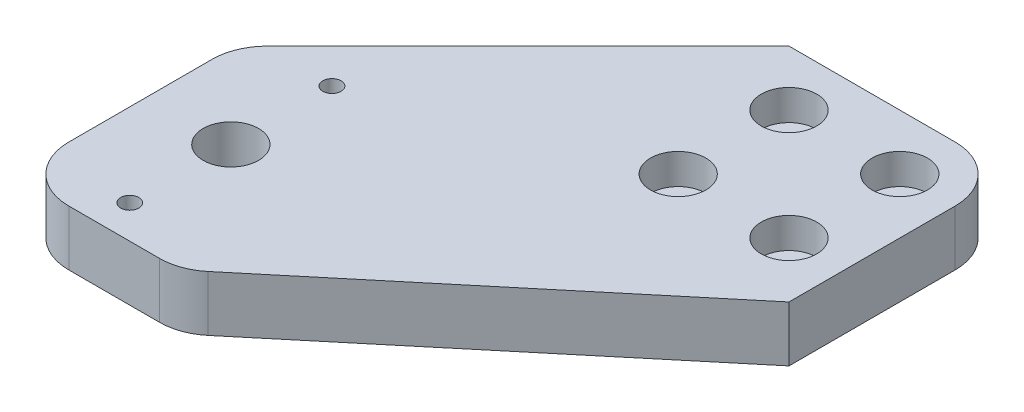
ISO-10303-21;
HEADER;
FILE_DESCRIPTION(('STEP AP214'),'2;1');
FILE_NAME('part.step','',(''),(''),'','','');
FILE_SCHEMA(('AUTOMOTIVE_DESIGN { 1 0 10303 214 1 1 1 1 }'));
ENDSEC;
DATA;
#1=APPLICATION_CONTEXT('core data for automotive mechanical design processes');
#2=APPLICATION_PROTOCOL_DEFINITION('international standard','automotive_design',2000,#1);
#3=PRODUCT_CONTEXT('',#1,'mechanical');
#4=PRODUCT('Part','Part','',(#3));
#5=PRODUCT_RELATED_PRODUCT_CATEGORY('part','',(#4));
#6=PRODUCT_DEFINITION_FORMATION('','',#4);
#7=PRODUCT_DEFINITION_CONTEXT('part definition',#1,'design');
#8=PRODUCT_DEFINITION('design','',#6,#7);
#9=PRODUCT_DEFINITION_SHAPE('','',#8);
#10=(LENGTH_UNIT() NAMED_UNIT(*) SI_UNIT(.MILLI.,.METRE.));
#11=(NAMED_UNIT(*) PLANE_ANGLE_UNIT() SI_UNIT($,.RADIAN.));
#12=(NAMED_UNIT(*) SI_UNIT($,.STERADIAN.) SOLID_ANGLE_UNIT());
#13=UNCERTAINTY_MEASURE_WITH_UNIT(LENGTH_MEASURE(1.E-05),#10,'distance_accuracy_value','');
#14=(GEOMETRIC_REPRESENTATION_CONTEXT(3) GLOBAL_UNCERTAINTY_ASSIGNED_CONTEXT((#13)) GLOBAL_UNIT_ASSIGNED_CONTEXT((#10,
#11,#12)) REPRESENTATION_CONTEXT('',''));
#15=CARTESIAN_POINT('',(0.,0.,0.));
#16=DIRECTION('',(0.,0.,1.));
#17=DIRECTION('',(1.,0.,0.));
#18=AXIS2_PLACEMENT_3D('',#15,#16,#17);
#19=CARTESIAN_POINT('',(-20.,5.,-20.));
#20=DIRECTION('',(0.707106781186548,0.,0.707106781186548));
#21=DIRECTION('',(0.707106781186548,0.,-0.707106781186548));
#22=AXIS2_PLACEMENT_3D('',#19,#20,#21);
#23=PLANE('',#22);
#24=DIRECTION('',(-0.707106781186547,0.,0.707106781186547));
#25=VECTOR('',#24,1.);
#26=CARTESIAN_POINT('',(-20.,-5.,-20.));
#27=LINE('',#26,#25);
#28=CARTESIAN_POINT('',(-20.,-5.,-20.));
#29=VERTEX_POINT('',#28);
#30=CARTESIAN_POINT('',(-67.0710678118655,-5.,27.0710678118655));
#31=VERTEX_POINT('',#30);
#32=EDGE_CURVE('E148',#29,#31,#27,.T.);
#33=ORIENTED_EDGE('',*,*,#32,.T.);
#34=DIRECTION('',(0.,-1.,0.));
#35=VECTOR('',#34,1.);
#36=CARTESIAN_POINT('',(-67.0710678118655,5.,27.0710678118655));
#37=LINE('',#36,#35);
#38=CARTESIAN_POINT('',(-67.0710678118655,5.,27.0710678118655));
#39=VERTEX_POINT('',#38);
#40=EDGE_CURVE('E191',#31,#39,#37,.F.);
#41=ORIENTED_EDGE('',*,*,#40,.T.);
#42=DIRECTION('',(-0.707106781186547,0.,0.707106781186547));
#43=VECTOR('',#42,1.);
#44=CARTESIAN_POINT('',(-20.,5.,-20.));
#45=LINE('',#44,#43);
#46=CARTESIAN_POINT('',(-20.,5.,-20.));
#47=VERTEX_POINT('',#46);
#48=EDGE_CURVE('E163',#47,#39,#45,.T.);
#49=ORIENTED_EDGE('',*,*,#48,.F.);
#50=DIRECTION('',(0.,-1.,0.));
#51=VECTOR('',#50,1.);
#52=CARTESIAN_POINT('',(-20.,5.,-20.));
#53=LINE('',#52,#51);
#54=EDGE_CURVE('E140',#47,#29,#53,.T.);
#55=ORIENTED_EDGE('',*,*,#54,.T.);
#56=EDGE_LOOP('',(#33,#41,#49,#55));
#57=FACE_BOUND('',#56,.T.);
#58=ADVANCED_FACE('F46',(#57),#23,.F.);
#59=CARTESIAN_POINT('',(-70.,5.,30.));
#60=DIRECTION('',(1.,0.,0.));
#61=DIRECTION('',(0.,0.,-1.));
#62=AXIS2_PLACEMENT_3D('',#59,#60,#61);
#63=PLANE('',#62);
#64=DIRECTION('',(0.,0.,1.));
#65=VECTOR('',#64,1.);
#66=CARTESIAN_POINT('',(-70.,-5.,30.));
#67=LINE('',#66,#65);
#68=CARTESIAN_POINT('',(-70.,-5.,34.1421356237309));
#69=VERTEX_POINT('',#68);
#70=CARTESIAN_POINT('',(-70.,-5.,60.));
#71=VERTEX_POINT('',#70);
#72=EDGE_CURVE('E151',#69,#71,#67,.T.);
#73=ORIENTED_EDGE('',*,*,#72,.T.);
#74=DIRECTION('',(0.,-1.,0.));
#75=VECTOR('',#74,1.);
#76=CARTESIAN_POINT('',(-70.,5.,60.));
#77=LINE('',#76,#75);
#78=CARTESIAN_POINT('',(-70.,5.,60.));
#79=VERTEX_POINT('',#78);
#80=EDGE_CURVE('E189',#71,#79,#77,.F.);
#81=ORIENTED_EDGE('',*,*,#80,.T.);
#82=DIRECTION('',(0.,0.,1.));
#83=VECTOR('',#82,1.);
#84=CARTESIAN_POINT('',(-70.,5.,30.));
#85=LINE('',#84,#83);
#86=CARTESIAN_POINT('',(-70.,5.,34.1421356237309));
#87=VERTEX_POINT('',#86);
#88=EDGE_CURVE('E213',#87,#79,#85,.T.);
#89=ORIENTED_EDGE('',*,*,#88,.F.);
#90=DIRECTION('',(0.,-1.,0.));
#91=VECTOR('',#90,1.);
#92=CARTESIAN_POINT('',(-70.,5.,34.1421356237309));
#93=LINE('',#92,#91);
#94=EDGE_CURVE('E186',#87,#69,#93,.T.);
#95=ORIENTED_EDGE('',*,*,#94,.T.);
#96=EDGE_LOOP('',(#73,#81,#89,#95));
#97=FACE_BOUND('',#96,.T.);
#98=ADVANCED_FACE('F216',(#97),#63,.F.);
#99=CARTESIAN_POINT('',(-70.,5.,70.));
#100=DIRECTION('',(0.,0.,-1.));
#101=DIRECTION('',(-1.,0.,0.));
#102=AXIS2_PLACEMENT_3D('',#99,#100,#101);
#103=PLANE('',#102);
#104=DIRECTION('',(1.,0.,0.));
#105=VECTOR('',#104,1.);
#106=CARTESIAN_POINT('',(-70.,-5.,70.));
#107=LINE('',#106,#105);
#108=CARTESIAN_POINT('',(-60.,-5.,70.));
#109=VERTEX_POINT('',#108);
#110=CARTESIAN_POINT('',(-43.6204993518133,-5.,70.));
#111=VERTEX_POINT('',#110);
#112=EDGE_CURVE('E155',#109,#111,#107,.T.);
#113=ORIENTED_EDGE('',*,*,#112,.T.);
#114=DIRECTION('',(0.,-1.,0.));
#115=VECTOR('',#114,1.);
#116=CARTESIAN_POINT('',(-43.6204993518133,5.,70.));
#117=LINE('',#116,#115);
#118=CARTESIAN_POINT('',(-43.6204993518133,5.,70.));
#119=VERTEX_POINT('',#118);
#120=EDGE_CURVE('E178',#111,#119,#117,.F.);
#121=ORIENTED_EDGE('',*,*,#120,.T.);
#122=DIRECTION('',(1.,0.,0.));
#123=VECTOR('',#122,1.);
#124=CARTESIAN_POINT('',(-70.,5.,70.));
#125=LINE('',#124,#123);
#126=CARTESIAN_POINT('',(-60.,5.,70.));
#127=VERTEX_POINT('',#126);
#128=EDGE_CURVE('E131',#127,#119,#125,.T.);
#129=ORIENTED_EDGE('',*,*,#128,.F.);
#130=DIRECTION('',(0.,-1.,0.));
#131=VECTOR('',#130,1.);
#132=CARTESIAN_POINT('',(-60.,5.,70.));
#133=LINE('',#132,#131);
#134=EDGE_CURVE('E175',#127,#109,#133,.T.);
#135=ORIENTED_EDGE('',*,*,#134,.T.);
#136=EDGE_LOOP('',(#113,#121,#129,#135));
#137=FACE_BOUND('',#136,.T.);
#138=ADVANCED_FACE('F334',(#137),#103,.F.);
#139=CARTESIAN_POINT('',(-40.,5.,70.));
#140=DIRECTION('',(-0.64018439966448,0.,-0.768221279597376));
#141=DIRECTION('',(-0.768221279597376,0.,0.64018439966448));
#142=AXIS2_PLACEMENT_3D('',#139,#140,#141);
#143=PLANE('',#142);
#144=DIRECTION('',(0.768221279597376,0.,-0.64018439966448));
#145=VECTOR('',#144,1.);
#146=CARTESIAN_POINT('',(-40.,5.,70.));
#147=LINE('',#146,#145);
#148=CARTESIAN_POINT('',(-37.2186553551685,5.,67.6822127959738));
#149=VERTEX_POINT('',#148);
#150=CARTESIAN_POINT('',(20.,5.,20.));
#151=VERTEX_POINT('',#150);
#152=EDGE_CURVE('E121',#149,#151,#147,.T.);
#153=ORIENTED_EDGE('',*,*,#152,.F.);
#154=DIRECTION('',(0.,-1.,0.));
#155=VECTOR('',#154,1.);
#156=CARTESIAN_POINT('',(-37.2186553551685,5.,67.6822127959738));
#157=LINE('',#156,#155);
#158=CARTESIAN_POINT('',(-37.2186553551685,-5.,67.6822127959738));
#159=VERTEX_POINT('',#158);
#160=EDGE_CURVE('E139',#149,#159,#157,.T.);
#161=ORIENTED_EDGE('',*,*,#160,.T.);
#162=DIRECTION('',(0.768221279597376,0.,-0.64018439966448));
#163=VECTOR('',#162,1.);
#164=CARTESIAN_POINT('',(-40.,-5.,70.));
#165=LINE('',#164,#163);
#166=CARTESIAN_POINT('',(20.,-5.,20.));
#167=VERTEX_POINT('',#166);
#168=EDGE_CURVE('E137',#159,#167,#165,.T.);
#169=ORIENTED_EDGE('',*,*,#168,.T.);
#170=DIRECTION('',(0.,-1.,0.));
#171=VECTOR('',#170,1.);
#172=CARTESIAN_POINT('',(20.,5.,20.));
#173=LINE('',#172,#171);
#174=EDGE_CURVE('E134',#151,#167,#173,.T.);
#175=ORIENTED_EDGE('',*,*,#174,.F.);
#176=EDGE_LOOP('',(#153,#161,#169,#175));
#177=FACE_BOUND('',#176,.T.);
#178=ADVANCED_FACE('F135',(#177),#143,.F.);
#179=CARTESIAN_POINT('',(20.,5.,-20.));
#180=DIRECTION('',(-1.,0.,0.));
#181=DIRECTION('',(0.,0.,1.));
#182=AXIS2_PLACEMENT_3D('',#179,#180,#181);
#183=PLANE('',#182);
#184=DIRECTION('',(0.,0.,-1.));
#185=VECTOR('',#184,1.);
#186=CARTESIAN_POINT('',(20.,-5.,-20.));
#187=LINE('',#186,#185);
#188=CARTESIAN_POINT('',(20.,-5.,-10.));
#189=VERTEX_POINT('',#188);
#190=EDGE_CURVE('E159',#167,#189,#187,.T.);
#191=ORIENTED_EDGE('',*,*,#190,.T.);
#192=DIRECTION('',(0.,-1.,0.));
#193=VECTOR('',#192,1.);
#194=CARTESIAN_POINT('',(20.,5.,-10.));
#195=LINE('',#194,#193);
#196=CARTESIAN_POINT('',(20.,5.,-10.));
#197=VERTEX_POINT('',#196);
#198=EDGE_CURVE('E11',#189,#197,#195,.F.);
#199=ORIENTED_EDGE('',*,*,#198,.T.);
#200=DIRECTION('',(0.,0.,-1.));
#201=VECTOR('',#200,1.);
#202=CARTESIAN_POINT('',(20.,5.,-20.));
#203=LINE('',#202,#201);
#204=EDGE_CURVE('E125',#151,#197,#203,.T.);
#205=ORIENTED_EDGE('',*,*,#204,.F.);
#206=ORIENTED_EDGE('',*,*,#174,.T.);
#207=EDGE_LOOP('',(#191,#199,#205,#206));
#208=FACE_BOUND('',#207,.T.);
#209=ADVANCED_FACE('F142',(#208),#183,.F.);
#210=CARTESIAN_POINT('',(-20.,5.,-20.));
#211=DIRECTION('',(0.,0.,1.));
#212=DIRECTION('',(1.,0.,0.));
#213=AXIS2_PLACEMENT_3D('',#210,#211,#212);
#214=PLANE('',#213);
#215=DIRECTION('',(-1.,0.,0.));
#216=VECTOR('',#215,1.);
#217=CARTESIAN_POINT('',(-20.,5.,-20.));
#218=LINE('',#217,#216);
#219=CARTESIAN_POINT('',(10.,5.,-20.));
#220=VERTEX_POINT('',#219);
#221=EDGE_CURVE('E143',#220,#47,#218,.T.);
#222=ORIENTED_EDGE('',*,*,#221,.F.);
#223=DIRECTION('',(0.,-1.,0.));
#224=VECTOR('',#223,1.);
#225=CARTESIAN_POINT('',(10.,5.,-20.));
#226=LINE('',#225,#224);
#227=CARTESIAN_POINT('',(10.,-5.,-20.));
#228=VERTEX_POINT('',#227);
#229=EDGE_CURVE('E54',#220,#228,#226,.T.);
#230=ORIENTED_EDGE('',*,*,#229,.T.);
#231=DIRECTION('',(-1.,0.,0.));
#232=VECTOR('',#231,1.);
#233=CARTESIAN_POINT('',(-20.,-5.,-20.));
#234=LINE('',#233,#232);
#235=EDGE_CURVE('E161',#228,#29,#234,.T.);
#236=ORIENTED_EDGE('',*,*,#235,.T.);
#237=ORIENTED_EDGE('',*,*,#54,.F.);
#238=EDGE_LOOP('',(#222,#230,#236,#237));
#239=FACE_BOUND('',#238,.T.);
#240=ADVANCED_FACE('F196',(#239),#214,.F.);
#241=CARTESIAN_POINT('',(0.,5.,0.));
#242=DIRECTION('',(0.,1.,0.));
#243=DIRECTION('',(0.,0.,1.));
#244=AXIS2_PLACEMENT_3D('',#241,#242,#243);
#245=PLANE('',#244);
#246=CARTESIAN_POINT('',(-55.,5.,45.75));
#247=DIRECTION('',(0.,1.,0.));
#248=DIRECTION('',(0.,0.,1.));
#249=AXIS2_PLACEMENT_3D('',#246,#247,#248);
#250=CIRCLE('',#249,5.);
#251=CARTESIAN_POINT('',(-55.,5.,50.75));
#252=VERTEX_POINT('',#251);
#253=EDGE_CURVE('E281',#252,#252,#250,.T.);
#254=ORIENTED_EDGE('',*,*,#253,.F.);
#255=EDGE_LOOP('',(#254));
#256=FACE_BOUND('',#255,.T.);
#257=CARTESIAN_POINT('',(-55.,5.,27.5));
#258=DIRECTION('',(0.,1.,0.));
#259=DIRECTION('',(0.,0.,1.));
#260=AXIS2_PLACEMENT_3D('',#257,#258,#259);
#261=CIRCLE('',#260,1.64999999999999);
#262=CARTESIAN_POINT('',(-55.,5.,29.15));
#263=VERTEX_POINT('',#262);
#264=EDGE_CURVE('E277',#263,#263,#261,.T.);
#265=ORIENTED_EDGE('',*,*,#264,.F.);
#266=EDGE_LOOP('',(#265));
#267=FACE_BOUND('',#266,.T.);
#268=CARTESIAN_POINT('',(-55.,5.,64.));
#269=DIRECTION('',(0.,1.,0.));
#270=DIRECTION('',(0.,0.,1.));
#271=AXIS2_PLACEMENT_3D('',#268,#269,#270);
#272=CIRCLE('',#271,1.64999999999998);
#273=CARTESIAN_POINT('',(-55.,5.,65.65));
#274=VERTEX_POINT('',#273);
#275=EDGE_CURVE('E271',#274,#274,#272,.T.);
#276=ORIENTED_EDGE('',*,*,#275,.F.);
#277=EDGE_LOOP('',(#276));
#278=FACE_BOUND('',#277,.T.);
#279=CARTESIAN_POINT('',(-10.,5.,-10.));
#280=DIRECTION('',(0.,1.,0.));
#281=DIRECTION('',(0.,0.,1.));
#282=AXIS2_PLACEMENT_3D('',#279,#280,#281);
#283=CIRCLE('',#282,4.99999999999999);
#284=CARTESIAN_POINT('',(-10.,5.,-5.00000000000001));
#285=VERTEX_POINT('',#284);
#286=EDGE_CURVE('E265',#285,#285,#283,.T.);
#287=ORIENTED_EDGE('',*,*,#286,.F.);
#288=EDGE_LOOP('',(#287));
#289=FACE_BOUND('',#288,.T.);
#290=CARTESIAN_POINT('',(10.,5.,-10.));
#291=DIRECTION('',(0.,1.,0.));
#292=DIRECTION('',(0.,0.,1.));
#293=AXIS2_PLACEMENT_3D('',#290,#291,#292);
#294=CIRCLE('',#293,4.99999999999999);
#295=CARTESIAN_POINT('',(10.,5.,-5.00000000000001));
#296=VERTEX_POINT('',#295);
#297=EDGE_CURVE('E253',#296,#296,#294,.T.);
#298=ORIENTED_EDGE('',*,*,#297,.F.);
#299=EDGE_LOOP('',(#298));
#300=FACE_BOUND('',#299,.T.);
#301=CARTESIAN_POINT('',(10.,5.,10.));
#302=DIRECTION('',(0.,1.,0.));
#303=DIRECTION('',(0.,0.,1.));
#304=AXIS2_PLACEMENT_3D('',#301,#302,#303);
#305=CIRCLE('',#304,4.99999999999999);
#306=CARTESIAN_POINT('',(10.,5.,15.));
#307=VERTEX_POINT('',#306);
#308=EDGE_CURVE('E241',#307,#307,#305,.T.);
#309=ORIENTED_EDGE('',*,*,#308,.F.);
#310=EDGE_LOOP('',(#309));
#311=FACE_BOUND('',#310,.T.);
#312=CARTESIAN_POINT('',(-10.,5.,10.));
#313=DIRECTION('',(0.,1.,0.));
#314=DIRECTION('',(0.,0.,1.));
#315=AXIS2_PLACEMENT_3D('',#312,#313,#314);
#316=CIRCLE('',#315,4.99999999999999);
#317=CARTESIAN_POINT('',(-10.,5.,15.));
#318=VERTEX_POINT('',#317);
#319=EDGE_CURVE('E229',#318,#318,#316,.T.);
#320=ORIENTED_EDGE('',*,*,#319,.F.);
#321=EDGE_LOOP('',(#320));
#322=FACE_BOUND('',#321,.T.);
#323=ORIENTED_EDGE('',*,*,#128,.T.);
#324=CARTESIAN_POINT('',(-43.6204993518133,5.,60.));
#325=DIRECTION('',(0.,1.,0.));
#326=DIRECTION('',(0.,0.,1.));
#327=AXIS2_PLACEMENT_3D('',#324,#325,#326);
#328=CIRCLE('',#327,10.);
#329=EDGE_CURVE('E127',#119,#149,#328,.T.);
#330=ORIENTED_EDGE('',*,*,#329,.T.);
#331=ORIENTED_EDGE('',*,*,#152,.T.);
#332=ORIENTED_EDGE('',*,*,#204,.T.);
#333=CARTESIAN_POINT('',(10.,5.,-10.));
#334=DIRECTION('',(0.,1.,0.));
#335=DIRECTION('',(0.,0.,1.));
#336=AXIS2_PLACEMENT_3D('',#333,#334,#335);
#337=CIRCLE('',#336,10.);
#338=EDGE_CURVE('E61',#197,#220,#337,.T.);
#339=ORIENTED_EDGE('',*,*,#338,.T.);
#340=ORIENTED_EDGE('',*,*,#221,.T.);
#341=ORIENTED_EDGE('',*,*,#48,.T.);
#342=CARTESIAN_POINT('',(-60.,5.,34.1421356237309));
#343=DIRECTION('',(0.,1.,0.));
#344=DIRECTION('',(0.,0.,1.));
#345=AXIS2_PLACEMENT_3D('',#342,#343,#344);
#346=CIRCLE('',#345,10.);
#347=EDGE_CURVE('E181',#39,#87,#346,.T.);
#348=ORIENTED_EDGE('',*,*,#347,.T.);
#349=ORIENTED_EDGE('',*,*,#88,.T.);
#350=CARTESIAN_POINT('',(-60.,5.,60.));
#351=DIRECTION('',(0.,1.,0.));
#352=DIRECTION('',(0.,0.,1.));
#353=AXIS2_PLACEMENT_3D('',#350,#351,#352);
#354=CIRCLE('',#353,10.);
#355=EDGE_CURVE('E183',#79,#127,#354,.T.);
#356=ORIENTED_EDGE('',*,*,#355,.T.);
#357=EDGE_LOOP('',(#323,#330,#331,#332,#339,#340,#341,#348,#349,#356));
#358=FACE_BOUND('',#357,.T.);
#359=ADVANCED_FACE('F124',(#256,#267,#278,#289,#300,#311,#322,#358),#245,.T.);
#360=CARTESIAN_POINT('',(0.,-5.,0.));
#361=DIRECTION('',(0.,1.,0.));
#362=DIRECTION('',(0.,0.,1.));
#363=AXIS2_PLACEMENT_3D('',#360,#361,#362);
#364=PLANE('',#363);
#365=CARTESIAN_POINT('',(-55.,-5.,45.75));
#366=DIRECTION('',(0.,1.,0.));
#367=DIRECTION('',(0.,0.,1.));
#368=AXIS2_PLACEMENT_3D('',#365,#366,#367);
#369=CIRCLE('',#368,5.);
#370=CARTESIAN_POINT('',(-55.,-5.,50.75));
#371=VERTEX_POINT('',#370);
#372=EDGE_CURVE('E280',#371,#371,#369,.T.);
#373=ORIENTED_EDGE('',*,*,#372,.T.);
#374=EDGE_LOOP('',(#373));
#375=FACE_BOUND('',#374,.T.);
#376=CARTESIAN_POINT('',(-55.,-5.,27.5));
#377=DIRECTION('',(0.,1.,0.));
#378=DIRECTION('',(0.,0.,1.));
#379=AXIS2_PLACEMENT_3D('',#376,#377,#378);
#380=CIRCLE('',#379,1.65);
#381=CARTESIAN_POINT('',(-55.,-5.,29.15));
#382=VERTEX_POINT('',#381);
#383=EDGE_CURVE('E274',#382,#382,#380,.T.);
#384=ORIENTED_EDGE('',*,*,#383,.T.);
#385=EDGE_LOOP('',(#384));
#386=FACE_BOUND('',#385,.T.);
#387=CARTESIAN_POINT('',(-55.,-5.,64.));
#388=DIRECTION('',(0.,1.,0.));
#389=DIRECTION('',(0.,0.,1.));
#390=AXIS2_PLACEMENT_3D('',#387,#388,#389);
#391=CIRCLE('',#390,1.65);
#392=CARTESIAN_POINT('',(-55.,-5.,65.65));
#393=VERTEX_POINT('',#392);
#394=EDGE_CURVE('E268',#393,#393,#391,.T.);
#395=ORIENTED_EDGE('',*,*,#394,.T.);
#396=EDGE_LOOP('',(#395));
#397=FACE_BOUND('',#396,.T.);
#398=CARTESIAN_POINT('',(-10.,-5.,-10.));
#399=DIRECTION('',(0.,1.,0.));
#400=DIRECTION('',(0.,0.,1.));
#401=AXIS2_PLACEMENT_3D('',#398,#399,#400);
#402=CIRCLE('',#401,2.75);
#403=CARTESIAN_POINT('',(-10.,-5.,-7.25));
#404=VERTEX_POINT('',#403);
#405=EDGE_CURVE('E256',#404,#404,#402,.T.);
#406=ORIENTED_EDGE('',*,*,#405,.T.);
#407=EDGE_LOOP('',(#406));
#408=FACE_BOUND('',#407,.T.);
#409=CARTESIAN_POINT('',(10.,-5.,-10.));
#410=DIRECTION('',(0.,1.,0.));
#411=DIRECTION('',(0.,0.,1.));
#412=AXIS2_PLACEMENT_3D('',#409,#410,#411);
#413=CIRCLE('',#412,2.75);
#414=CARTESIAN_POINT('',(10.,-5.,-7.25));
#415=VERTEX_POINT('',#414);
#416=EDGE_CURVE('E244',#415,#415,#413,.T.);
#417=ORIENTED_EDGE('',*,*,#416,.T.);
#418=EDGE_LOOP('',(#417));
#419=FACE_BOUND('',#418,.T.);
#420=CARTESIAN_POINT('',(10.,-5.,10.));
#421=DIRECTION('',(0.,1.,0.));
#422=DIRECTION('',(0.,0.,1.));
#423=AXIS2_PLACEMENT_3D('',#420,#421,#422);
#424=CIRCLE('',#423,2.75);
#425=CARTESIAN_POINT('',(10.,-5.,12.75));
#426=VERTEX_POINT('',#425);
#427=EDGE_CURVE('E232',#426,#426,#424,.T.);
#428=ORIENTED_EDGE('',*,*,#427,.T.);
#429=EDGE_LOOP('',(#428));
#430=FACE_BOUND('',#429,.T.);
#431=CARTESIAN_POINT('',(-10.,-5.,10.));
#432=DIRECTION('',(0.,1.,0.));
#433=DIRECTION('',(0.,0.,1.));
#434=AXIS2_PLACEMENT_3D('',#431,#432,#433);
#435=CIRCLE('',#434,2.75);
#436=CARTESIAN_POINT('',(-10.,-5.,12.75));
#437=VERTEX_POINT('',#436);
#438=EDGE_CURVE('E152',#437,#437,#435,.T.);
#439=ORIENTED_EDGE('',*,*,#438,.T.);
#440=EDGE_LOOP('',(#439));
#441=FACE_BOUND('',#440,.T.);
#442=ORIENTED_EDGE('',*,*,#168,.F.);
#443=CARTESIAN_POINT('',(-43.6204993518133,-5.,60.));
#444=DIRECTION('',(0.,1.,0.));
#445=DIRECTION('',(0.,0.,1.));
#446=AXIS2_PLACEMENT_3D('',#443,#444,#445);
#447=CIRCLE('',#446,10.);
#448=EDGE_CURVE('E173',#159,#111,#447,.F.);
#449=ORIENTED_EDGE('',*,*,#448,.T.);
#450=ORIENTED_EDGE('',*,*,#112,.F.);
#451=CARTESIAN_POINT('',(-60.,-5.,60.));
#452=DIRECTION('',(0.,1.,0.));
#453=DIRECTION('',(0.,0.,1.));
#454=AXIS2_PLACEMENT_3D('',#451,#452,#453);
#455=CIRCLE('',#454,10.);
#456=EDGE_CURVE('E171',#109,#71,#455,.F.);
#457=ORIENTED_EDGE('',*,*,#456,.T.);
#458=ORIENTED_EDGE('',*,*,#72,.F.);
#459=CARTESIAN_POINT('',(-60.,-5.,34.1421356237309));
#460=DIRECTION('',(0.,1.,0.));
#461=DIRECTION('',(0.,0.,1.));
#462=AXIS2_PLACEMENT_3D('',#459,#460,#461);
#463=CIRCLE('',#462,10.);
#464=EDGE_CURVE('E169',#69,#31,#463,.F.);
#465=ORIENTED_EDGE('',*,*,#464,.T.);
#466=ORIENTED_EDGE('',*,*,#32,.F.);
#467=ORIENTED_EDGE('',*,*,#235,.F.);
#468=CARTESIAN_POINT('',(10.,-5.,-10.));
#469=DIRECTION('',(0.,1.,0.));
#470=DIRECTION('',(0.,0.,1.));
#471=AXIS2_PLACEMENT_3D('',#468,#469,#470);
#472=CIRCLE('',#471,10.);
#473=EDGE_CURVE('E167',#228,#189,#472,.F.);
#474=ORIENTED_EDGE('',*,*,#473,.T.);
#475=ORIENTED_EDGE('',*,*,#190,.F.);
#476=EDGE_LOOP('',(#442,#449,#450,#457,#458,#465,#466,#467,#474,#475));
#477=FACE_BOUND('',#476,.T.);
#478=ADVANCED_FACE('F201',(#375,#386,#397,#408,#419,#430,#441,#477),#364,.F.);
#479=CARTESIAN_POINT('',(-10.,5.,10.));
#480=DIRECTION('',(0.,1.,0.));
#481=DIRECTION('',(0.,0.,1.));
#482=AXIS2_PLACEMENT_3D('',#479,#480,#481);
#483=CYLINDRICAL_SURFACE('',#482,2.75);
#484=ORIENTED_EDGE('',*,*,#438,.F.);
#485=EDGE_LOOP('',(#484));
#486=FACE_BOUND('',#485,.T.);
#487=CARTESIAN_POINT('',(-10.,-0.5,10.));
#488=DIRECTION('',(0.,1.,0.));
#489=DIRECTION('',(0.,0.,1.));
#490=AXIS2_PLACEMENT_3D('',#487,#488,#489);
#491=CIRCLE('',#490,2.75);
#492=CARTESIAN_POINT('',(-10.,-0.5,12.75));
#493=VERTEX_POINT('',#492);
#494=EDGE_CURVE('E223',#493,#493,#491,.T.);
#495=ORIENTED_EDGE('',*,*,#494,.T.);
#496=EDGE_LOOP('',(#495));
#497=FACE_BOUND('',#496,.T.);
#498=ADVANCED_FACE('F325',(#486,#497),#483,.F.);
#499=CARTESIAN_POINT('',(-7.25,-0.5,10.));
#500=DIRECTION('',(0.,-1.,0.));
#501=DIRECTION('',(0.,0.,-1.));
#502=AXIS2_PLACEMENT_3D('',#499,#500,#501);
#503=PLANE('',#502);
#504=ORIENTED_EDGE('',*,*,#494,.F.);
#505=EDGE_LOOP('',(#504));
#506=FACE_BOUND('',#505,.T.);
#507=CARTESIAN_POINT('',(-10.,-0.5,10.));
#508=DIRECTION('',(0.,1.,0.));
#509=DIRECTION('',(0.,0.,1.));
#510=AXIS2_PLACEMENT_3D('',#507,#508,#509);
#511=CIRCLE('',#510,5.);
#512=CARTESIAN_POINT('',(-10.,-0.5,15.));
#513=VERTEX_POINT('',#512);
#514=EDGE_CURVE('E226',#513,#513,#511,.T.);
#515=ORIENTED_EDGE('',*,*,#514,.T.);
#516=EDGE_LOOP('',(#515));
#517=FACE_BOUND('',#516,.T.);
#518=ADVANCED_FACE('F315',(#506,#517),#503,.F.);
#519=CARTESIAN_POINT('',(-10.,5.,10.));
#520=DIRECTION('',(0.,1.,0.));
#521=DIRECTION('',(0.,0.,1.));
#522=AXIS2_PLACEMENT_3D('',#519,#520,#521);
#523=CYLINDRICAL_SURFACE('',#522,5.);
#524=ORIENTED_EDGE('',*,*,#514,.F.);
#525=EDGE_LOOP('',(#524));
#526=FACE_BOUND('',#525,.T.);
#527=ORIENTED_EDGE('',*,*,#319,.T.);
#528=EDGE_LOOP('',(#527));
#529=FACE_BOUND('',#528,.T.);
#530=ADVANCED_FACE('F312',(#526,#529),#523,.F.);
#531=CARTESIAN_POINT('',(10.,5.,10.));
#532=DIRECTION('',(0.,1.,0.));
#533=DIRECTION('',(0.,0.,1.));
#534=AXIS2_PLACEMENT_3D('',#531,#532,#533);
#535=CYLINDRICAL_SURFACE('',#534,2.75);
#536=ORIENTED_EDGE('',*,*,#427,.F.);
#537=EDGE_LOOP('',(#536));
#538=FACE_BOUND('',#537,.T.);
#539=CARTESIAN_POINT('',(10.,-0.5,10.));
#540=DIRECTION('',(0.,1.,0.));
#541=DIRECTION('',(0.,0.,1.));
#542=AXIS2_PLACEMENT_3D('',#539,#540,#541);
#543=CIRCLE('',#542,2.75);
#544=CARTESIAN_POINT('',(10.,-0.5,12.75));
#545=VERTEX_POINT('',#544);
#546=EDGE_CURVE('E235',#545,#545,#543,.T.);
#547=ORIENTED_EDGE('',*,*,#546,.T.);
#548=EDGE_LOOP('',(#547));
#549=FACE_BOUND('',#548,.T.);
#550=ADVANCED_FACE('F314',(#538,#549),#535,.F.);
#551=CARTESIAN_POINT('',(12.75,-0.5,10.));
#552=DIRECTION('',(0.,-1.,0.));
#553=DIRECTION('',(0.,0.,-1.));
#554=AXIS2_PLACEMENT_3D('',#551,#552,#553);
#555=PLANE('',#554);
#556=ORIENTED_EDGE('',*,*,#546,.F.);
#557=EDGE_LOOP('',(#556));
#558=FACE_BOUND('',#557,.T.);
#559=CARTESIAN_POINT('',(10.,-0.5,10.));
#560=DIRECTION('',(0.,1.,0.));
#561=DIRECTION('',(0.,0.,1.));
#562=AXIS2_PLACEMENT_3D('',#559,#560,#561);
#563=CIRCLE('',#562,5.);
#564=CARTESIAN_POINT('',(10.,-0.5,15.));
#565=VERTEX_POINT('',#564);
#566=EDGE_CURVE('E238',#565,#565,#563,.T.);
#567=ORIENTED_EDGE('',*,*,#566,.T.);
#568=EDGE_LOOP('',(#567));
#569=FACE_BOUND('',#568,.T.);
#570=ADVANCED_FACE('F322',(#558,#569),#555,.F.);
#571=CARTESIAN_POINT('',(10.,5.,10.));
#572=DIRECTION('',(0.,1.,0.));
#573=DIRECTION('',(0.,0.,1.));
#574=AXIS2_PLACEMENT_3D('',#571,#572,#573);
#575=CYLINDRICAL_SURFACE('',#574,5.);
#576=ORIENTED_EDGE('',*,*,#566,.F.);
#577=EDGE_LOOP('',(#576));
#578=FACE_BOUND('',#577,.T.);
#579=ORIENTED_EDGE('',*,*,#308,.T.);
#580=EDGE_LOOP('',(#579));
#581=FACE_BOUND('',#580,.T.);
#582=ADVANCED_FACE('F457',(#578,#581),#575,.F.);
#583=CARTESIAN_POINT('',(10.,5.,-10.));
#584=DIRECTION('',(0.,1.,0.));
#585=DIRECTION('',(0.,0.,1.));
#586=AXIS2_PLACEMENT_3D('',#583,#584,#585);
#587=CYLINDRICAL_SURFACE('',#586,2.75);
#588=ORIENTED_EDGE('',*,*,#416,.F.);
#589=EDGE_LOOP('',(#588));
#590=FACE_BOUND('',#589,.T.);
#591=CARTESIAN_POINT('',(10.,-0.5,-10.));
#592=DIRECTION('',(0.,1.,0.));
#593=DIRECTION('',(0.,0.,1.));
#594=AXIS2_PLACEMENT_3D('',#591,#592,#593);
#595=CIRCLE('',#594,2.75);
#596=CARTESIAN_POINT('',(10.,-0.5,-7.25));
#597=VERTEX_POINT('',#596);
#598=EDGE_CURVE('E247',#597,#597,#595,.T.);
#599=ORIENTED_EDGE('',*,*,#598,.T.);
#600=EDGE_LOOP('',(#599));
#601=FACE_BOUND('',#600,.T.);
#602=ADVANCED_FACE('F447',(#590,#601),#587,.F.);
#603=CARTESIAN_POINT('',(12.75,-0.5,-10.));
#604=DIRECTION('',(0.,-1.,0.));
#605=DIRECTION('',(0.,0.,-1.));
#606=AXIS2_PLACEMENT_3D('',#603,#604,#605);
#607=PLANE('',#606);
#608=ORIENTED_EDGE('',*,*,#598,.F.);
#609=EDGE_LOOP('',(#608));
#610=FACE_BOUND('',#609,.T.);
#611=CARTESIAN_POINT('',(10.,-0.5,-10.));
#612=DIRECTION('',(0.,1.,0.));
#613=DIRECTION('',(0.,0.,1.));
#614=AXIS2_PLACEMENT_3D('',#611,#612,#613);
#615=CIRCLE('',#614,5.);
#616=CARTESIAN_POINT('',(10.,-0.5,-5.));
#617=VERTEX_POINT('',#616);
#618=EDGE_CURVE('E250',#617,#617,#615,.T.);
#619=ORIENTED_EDGE('',*,*,#618,.T.);
#620=EDGE_LOOP('',(#619));
#621=FACE_BOUND('',#620,.T.);
#622=ADVANCED_FACE('F437',(#610,#621),#607,.F.);
#623=CARTESIAN_POINT('',(10.,5.,-10.));
#624=DIRECTION('',(0.,1.,0.));
#625=DIRECTION('',(0.,0.,1.));
#626=AXIS2_PLACEMENT_3D('',#623,#624,#625);
#627=CYLINDRICAL_SURFACE('',#626,5.);
#628=ORIENTED_EDGE('',*,*,#618,.F.);
#629=EDGE_LOOP('',(#628));
#630=FACE_BOUND('',#629,.T.);
#631=ORIENTED_EDGE('',*,*,#297,.T.);
#632=EDGE_LOOP('',(#631));
#633=FACE_BOUND('',#632,.T.);
#634=ADVANCED_FACE('F427',(#630,#633),#627,.F.);
#635=CARTESIAN_POINT('',(-10.,5.,-10.));
#636=DIRECTION('',(0.,1.,0.));
#637=DIRECTION('',(0.,0.,1.));
#638=AXIS2_PLACEMENT_3D('',#635,#636,#637);
#639=CYLINDRICAL_SURFACE('',#638,2.75);
#640=ORIENTED_EDGE('',*,*,#405,.F.);
#641=EDGE_LOOP('',(#640));
#642=FACE_BOUND('',#641,.T.);
#643=CARTESIAN_POINT('',(-10.,-0.5,-10.));
#644=DIRECTION('',(0.,1.,0.));
#645=DIRECTION('',(0.,0.,1.));
#646=AXIS2_PLACEMENT_3D('',#643,#644,#645);
#647=CIRCLE('',#646,2.75);
#648=CARTESIAN_POINT('',(-10.,-0.5,-7.25));
#649=VERTEX_POINT('',#648);
#650=EDGE_CURVE('E259',#649,#649,#647,.T.);
#651=ORIENTED_EDGE('',*,*,#650,.T.);
#652=EDGE_LOOP('',(#651));
#653=FACE_BOUND('',#652,.T.);
#654=ADVANCED_FACE('F417',(#642,#653),#639,.F.);
#655=CARTESIAN_POINT('',(-7.25,-0.5,-10.));
#656=DIRECTION('',(0.,-1.,0.));
#657=DIRECTION('',(0.,0.,-1.));
#658=AXIS2_PLACEMENT_3D('',#655,#656,#657);
#659=PLANE('',#658);
#660=ORIENTED_EDGE('',*,*,#650,.F.);
#661=EDGE_LOOP('',(#660));
#662=FACE_BOUND('',#661,.T.);
#663=CARTESIAN_POINT('',(-10.,-0.5,-10.));
#664=DIRECTION('',(0.,1.,0.));
#665=DIRECTION('',(0.,0.,1.));
#666=AXIS2_PLACEMENT_3D('',#663,#664,#665);
#667=CIRCLE('',#666,5.);
#668=CARTESIAN_POINT('',(-10.,-0.5,-5.));
#669=VERTEX_POINT('',#668);
#670=EDGE_CURVE('E262',#669,#669,#667,.T.);
#671=ORIENTED_EDGE('',*,*,#670,.T.);
#672=EDGE_LOOP('',(#671));
#673=FACE_BOUND('',#672,.T.);
#674=ADVANCED_FACE('F407',(#662,#673),#659,.F.);
#675=CARTESIAN_POINT('',(-10.,5.,-10.));
#676=DIRECTION('',(0.,1.,0.));
#677=DIRECTION('',(0.,0.,1.));
#678=AXIS2_PLACEMENT_3D('',#675,#676,#677);
#679=CYLINDRICAL_SURFACE('',#678,5.);
#680=ORIENTED_EDGE('',*,*,#670,.F.);
#681=EDGE_LOOP('',(#680));
#682=FACE_BOUND('',#681,.T.);
#683=ORIENTED_EDGE('',*,*,#286,.T.);
#684=EDGE_LOOP('',(#683));
#685=FACE_BOUND('',#684,.T.);
#686=ADVANCED_FACE('F396',(#682,#685),#679,.F.);
#687=CARTESIAN_POINT('',(-55.,5.,64.));
#688=DIRECTION('',(0.,1.,0.));
#689=DIRECTION('',(0.,0.,1.));
#690=AXIS2_PLACEMENT_3D('',#687,#688,#689);
#691=CYLINDRICAL_SURFACE('',#690,1.64999999999999);
#692=ORIENTED_EDGE('',*,*,#394,.F.);
#693=EDGE_LOOP('',(#692));
#694=FACE_BOUND('',#693,.T.);
#695=ORIENTED_EDGE('',*,*,#275,.T.);
#696=EDGE_LOOP('',(#695));
#697=FACE_BOUND('',#696,.T.);
#698=ADVANCED_FACE('F384',(#694,#697),#691,.F.);
#699=CARTESIAN_POINT('',(-55.,5.,27.5));
#700=DIRECTION('',(0.,1.,0.));
#701=DIRECTION('',(0.,0.,1.));
#702=AXIS2_PLACEMENT_3D('',#699,#700,#701);
#703=CYLINDRICAL_SURFACE('',#702,1.65);
#704=ORIENTED_EDGE('',*,*,#383,.F.);
#705=EDGE_LOOP('',(#704));
#706=FACE_BOUND('',#705,.T.);
#707=ORIENTED_EDGE('',*,*,#264,.T.);
#708=EDGE_LOOP('',(#707));
#709=FACE_BOUND('',#708,.T.);
#710=ADVANCED_FACE('F293',(#706,#709),#703,.F.);
#711=CARTESIAN_POINT('',(-55.,-5.,45.75));
#712=DIRECTION('',(0.,1.,0.));
#713=DIRECTION('',(0.,0.,1.));
#714=AXIS2_PLACEMENT_3D('',#711,#712,#713);
#715=CYLINDRICAL_SURFACE('',#714,5.);
#716=ORIENTED_EDGE('',*,*,#372,.F.);
#717=EDGE_LOOP('',(#716));
#718=FACE_BOUND('',#717,.T.);
#719=ORIENTED_EDGE('',*,*,#253,.T.);
#720=EDGE_LOOP('',(#719));
#721=FACE_BOUND('',#720,.T.);
#722=ADVANCED_FACE('F289',(#718,#721),#715,.F.);
#723=CARTESIAN_POINT('',(-43.6204993518133,5.,60.));
#724=DIRECTION('',(0.,-1.,0.));
#725=DIRECTION('',(0.,0.,-1.));
#726=AXIS2_PLACEMENT_3D('',#723,#724,#725);
#727=CYLINDRICAL_SURFACE('',#726,10.);
#728=ORIENTED_EDGE('',*,*,#329,.F.);
#729=ORIENTED_EDGE('',*,*,#120,.F.);
#730=ORIENTED_EDGE('',*,*,#448,.F.);
#731=ORIENTED_EDGE('',*,*,#160,.F.);
#732=EDGE_LOOP('',(#728,#729,#730,#731));
#733=FACE_BOUND('',#732,.T.);
#734=ADVANCED_FACE('F292',(#733),#727,.T.);
#735=CARTESIAN_POINT('',(-60.,5.,60.));
#736=DIRECTION('',(0.,-1.,0.));
#737=DIRECTION('',(0.,0.,-1.));
#738=AXIS2_PLACEMENT_3D('',#735,#736,#737);
#739=CYLINDRICAL_SURFACE('',#738,10.);
#740=ORIENTED_EDGE('',*,*,#355,.F.);
#741=ORIENTED_EDGE('',*,*,#80,.F.);
#742=ORIENTED_EDGE('',*,*,#456,.F.);
#743=ORIENTED_EDGE('',*,*,#134,.F.);
#744=EDGE_LOOP('',(#740,#741,#742,#743));
#745=FACE_BOUND('',#744,.T.);
#746=ADVANCED_FACE('F340',(#745),#739,.T.);
#747=CARTESIAN_POINT('',(-60.,5.,34.1421356237309));
#748=DIRECTION('',(0.,-1.,0.));
#749=DIRECTION('',(0.,0.,-1.));
#750=AXIS2_PLACEMENT_3D('',#747,#748,#749);
#751=CYLINDRICAL_SURFACE('',#750,10.);
#752=ORIENTED_EDGE('',*,*,#347,.F.);
#753=ORIENTED_EDGE('',*,*,#40,.F.);
#754=ORIENTED_EDGE('',*,*,#464,.F.);
#755=ORIENTED_EDGE('',*,*,#94,.F.);
#756=EDGE_LOOP('',(#752,#753,#754,#755));
#757=FACE_BOUND('',#756,.T.);
#758=ADVANCED_FACE('F209',(#757),#751,.T.);
#759=CARTESIAN_POINT('',(10.,5.,-10.));
#760=DIRECTION('',(0.,-1.,0.));
#761=DIRECTION('',(0.,0.,-1.));
#762=AXIS2_PLACEMENT_3D('',#759,#760,#761);
#763=CYLINDRICAL_SURFACE('',#762,10.);
#764=ORIENTED_EDGE('',*,*,#338,.F.);
#765=ORIENTED_EDGE('',*,*,#198,.F.);
#766=ORIENTED_EDGE('',*,*,#473,.F.);
#767=ORIENTED_EDGE('',*,*,#229,.F.);
#768=EDGE_LOOP('',(#764,#765,#766,#767));
#769=FACE_BOUND('',#768,.T.);
#770=ADVANCED_FACE('F48',(#769),#763,.T.);
#771=CLOSED_SHELL('',(#58,#98,#138,#178,#209,#240,#359,#478,#498,#518,#530,#550,#570,#582,#602,
#622,#634,#654,#674,#686,#698,#710,#722,#734,#746,#758,#770));
#772=MANIFOLD_SOLID_BREP('B2',#771);
#773=ADVANCED_BREP_SHAPE_REPRESENTATION('',(#18,#772),#14);
#774=SHAPE_DEFINITION_REPRESENTATION(#9,#773);
ENDSEC;
END-ISO-10303-21;
